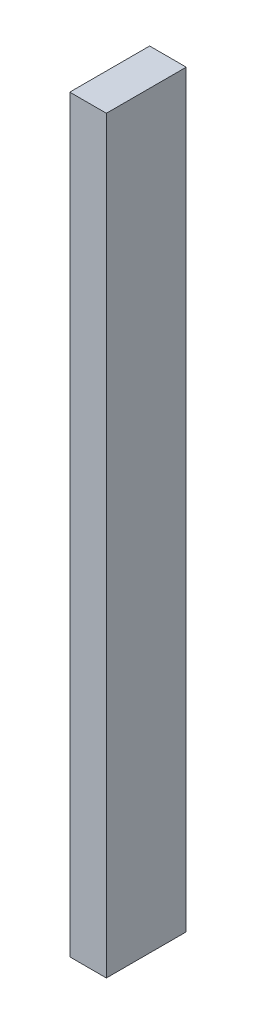
ISO-10303-21;
HEADER;
FILE_DESCRIPTION(('STEP AP214'),'2;1');
FILE_NAME('part.step','',(''),(''),'','','');
FILE_SCHEMA(('AUTOMOTIVE_DESIGN { 1 0 10303 214 1 1 1 1 }'));
ENDSEC;
DATA;
#1=APPLICATION_CONTEXT('core data for automotive mechanical design processes');
#2=APPLICATION_PROTOCOL_DEFINITION('international standard','automotive_design',2000,#1);
#3=PRODUCT_CONTEXT('',#1,'mechanical');
#4=PRODUCT('Part','Part','',(#3));
#5=PRODUCT_RELATED_PRODUCT_CATEGORY('part','',(#4));
#6=PRODUCT_DEFINITION_FORMATION('','',#4);
#7=PRODUCT_DEFINITION_CONTEXT('part definition',#1,'design');
#8=PRODUCT_DEFINITION('design','',#6,#7);
#9=PRODUCT_DEFINITION_SHAPE('','',#8);
#10=(LENGTH_UNIT() NAMED_UNIT(*) SI_UNIT(.MILLI.,.METRE.));
#11=(NAMED_UNIT(*) PLANE_ANGLE_UNIT() SI_UNIT($,.RADIAN.));
#12=(NAMED_UNIT(*) SI_UNIT($,.STERADIAN.) SOLID_ANGLE_UNIT());
#13=UNCERTAINTY_MEASURE_WITH_UNIT(LENGTH_MEASURE(1.E-05),#10,'distance_accuracy_value','');
#14=(GEOMETRIC_REPRESENTATION_CONTEXT(3) GLOBAL_UNCERTAINTY_ASSIGNED_CONTEXT((#13)) GLOBAL_UNIT_ASSIGNED_CONTEXT((#10,
#11,#12)) REPRESENTATION_CONTEXT('',''));
#15=CARTESIAN_POINT('',(0.,0.,0.));
#16=DIRECTION('',(0.,0.,1.));
#17=DIRECTION('',(1.,0.,0.));
#18=AXIS2_PLACEMENT_3D('',#15,#16,#17);
#19=CARTESIAN_POINT('',(22.,-0.01,48.01));
#20=DIRECTION('',(1.,0.,0.));
#21=DIRECTION('',(0.,0.,-1.));
#22=AXIS2_PLACEMENT_3D('',#19,#20,#21);
#23=PLANE('',#22);
#24=DIRECTION('',(0.,0.,-1.));
#25=VECTOR('',#24,1.);
#26=CARTESIAN_POINT('',(22.,450.,24.));
#27=LINE('',#26,#25);
#28=CARTESIAN_POINT('',(22.,450.,48.));
#29=VERTEX_POINT('',#28);
#30=CARTESIAN_POINT('',(22.,450.,0.));
#31=VERTEX_POINT('',#30);
#32=EDGE_CURVE('E69',#29,#31,#27,.T.);
#33=ORIENTED_EDGE('',*,*,#32,.F.);
#34=DIRECTION('',(0.,1.,0.));
#35=VECTOR('',#34,1.);
#36=CARTESIAN_POINT('',(22.,225.,48.));
#37=LINE('',#36,#35);
#38=CARTESIAN_POINT('',(22.,0.,48.));
#39=VERTEX_POINT('',#38);
#40=EDGE_CURVE('E56',#39,#29,#37,.T.);
#41=ORIENTED_EDGE('',*,*,#40,.F.);
#42=DIRECTION('',(0.,0.,1.));
#43=VECTOR('',#42,1.);
#44=CARTESIAN_POINT('',(22.,0.,24.));
#45=LINE('',#44,#43);
#46=CARTESIAN_POINT('',(22.,0.,0.));
#47=VERTEX_POINT('',#46);
#48=EDGE_CURVE('E21',#47,#39,#45,.T.);
#49=ORIENTED_EDGE('',*,*,#48,.F.);
#50=DIRECTION('',(0.,-1.,0.));
#51=VECTOR('',#50,1.);
#52=CARTESIAN_POINT('',(22.,225.,0.));
#53=LINE('',#52,#51);
#54=EDGE_CURVE('E82',#31,#47,#53,.T.);
#55=ORIENTED_EDGE('',*,*,#54,.F.);
#56=EDGE_LOOP('',(#33,#41,#49,#55));
#57=FACE_BOUND('',#56,.T.);
#58=ADVANCED_FACE('F17',(#57),#23,.T.);
#59=CARTESIAN_POINT('',(22.01,0.,48.01));
#60=DIRECTION('',(0.,-1.,0.));
#61=DIRECTION('',(-1.,0.,0.));
#62=AXIS2_PLACEMENT_3D('',#59,#60,#61);
#63=PLANE('',#62);
#64=DIRECTION('',(-1.,0.,0.));
#65=VECTOR('',#64,1.);
#66=CARTESIAN_POINT('',(11.,0.,0.));
#67=LINE('',#66,#65);
#68=CARTESIAN_POINT('',(0.,0.,0.));
#69=VERTEX_POINT('',#68);
#70=EDGE_CURVE('E65',#47,#69,#67,.T.);
#71=ORIENTED_EDGE('',*,*,#70,.F.);
#72=ORIENTED_EDGE('',*,*,#48,.T.);
#73=DIRECTION('',(1.,0.,0.));
#74=VECTOR('',#73,1.);
#75=CARTESIAN_POINT('',(11.,0.,48.));
#76=LINE('',#75,#74);
#77=CARTESIAN_POINT('',(0.,0.,48.));
#78=VERTEX_POINT('',#77);
#79=EDGE_CURVE('E62',#78,#39,#76,.T.);
#80=ORIENTED_EDGE('',*,*,#79,.F.);
#81=DIRECTION('',(0.,0.,1.));
#82=VECTOR('',#81,1.);
#83=CARTESIAN_POINT('',(0.,0.,24.));
#84=LINE('',#83,#82);
#85=EDGE_CURVE('E84',#69,#78,#84,.T.);
#86=ORIENTED_EDGE('',*,*,#85,.F.);
#87=EDGE_LOOP('',(#71,#72,#80,#86));
#88=FACE_BOUND('',#87,.T.);
#89=ADVANCED_FACE('F61',(#88),#63,.T.);
#90=CARTESIAN_POINT('',(-0.01,-0.01,48.));
#91=DIRECTION('',(0.,0.,1.));
#92=DIRECTION('',(1.,0.,0.));
#93=AXIS2_PLACEMENT_3D('',#90,#91,#92);
#94=PLANE('',#93);
#95=DIRECTION('',(1.,0.,0.));
#96=VECTOR('',#95,1.);
#97=CARTESIAN_POINT('',(11.,450.,48.));
#98=LINE('',#97,#96);
#99=CARTESIAN_POINT('',(0.,450.,48.));
#100=VERTEX_POINT('',#99);
#101=EDGE_CURVE('E71',#100,#29,#98,.T.);
#102=ORIENTED_EDGE('',*,*,#101,.F.);
#103=DIRECTION('',(0.,1.,0.));
#104=VECTOR('',#103,1.);
#105=CARTESIAN_POINT('',(0.,225.,48.));
#106=LINE('',#105,#104);
#107=EDGE_CURVE('E75',#78,#100,#106,.T.);
#108=ORIENTED_EDGE('',*,*,#107,.F.);
#109=ORIENTED_EDGE('',*,*,#79,.T.);
#110=ORIENTED_EDGE('',*,*,#40,.T.);
#111=EDGE_LOOP('',(#102,#108,#109,#110));
#112=FACE_BOUND('',#111,.T.);
#113=ADVANCED_FACE('F73',(#112),#94,.T.);
#114=CARTESIAN_POINT('',(-0.00999999999999891,450.,-0.00999999999999891));
#115=DIRECTION('',(0.,1.,0.));
#116=DIRECTION('',(0.,0.,1.));
#117=AXIS2_PLACEMENT_3D('',#114,#115,#116);
#118=PLANE('',#117);
#119=DIRECTION('',(1.,0.,0.));
#120=VECTOR('',#119,1.);
#121=CARTESIAN_POINT('',(11.,450.,0.));
#122=LINE('',#121,#120);
#123=CARTESIAN_POINT('',(0.,450.,0.));
#124=VERTEX_POINT('',#123);
#125=EDGE_CURVE('E36',#124,#31,#122,.T.);
#126=ORIENTED_EDGE('',*,*,#125,.F.);
#127=DIRECTION('',(0.,0.,-1.));
#128=VECTOR('',#127,1.);
#129=CARTESIAN_POINT('',(0.,450.,24.));
#130=LINE('',#129,#128);
#131=EDGE_CURVE('E27',#100,#124,#130,.T.);
#132=ORIENTED_EDGE('',*,*,#131,.F.);
#133=ORIENTED_EDGE('',*,*,#101,.T.);
#134=ORIENTED_EDGE('',*,*,#32,.T.);
#135=EDGE_LOOP('',(#126,#132,#133,#134));
#136=FACE_BOUND('',#135,.T.);
#137=ADVANCED_FACE('F89',(#136),#118,.T.);
#138=CARTESIAN_POINT('',(22.01,-0.01,0.));
#139=DIRECTION('',(0.,0.,-1.));
#140=DIRECTION('',(-1.,0.,0.));
#141=AXIS2_PLACEMENT_3D('',#138,#139,#140);
#142=PLANE('',#141);
#143=ORIENTED_EDGE('',*,*,#125,.T.);
#144=ORIENTED_EDGE('',*,*,#54,.T.);
#145=ORIENTED_EDGE('',*,*,#70,.T.);
#146=DIRECTION('',(0.,-1.,0.));
#147=VECTOR('',#146,1.);
#148=CARTESIAN_POINT('',(0.,225.,0.));
#149=LINE('',#148,#147);
#150=EDGE_CURVE('E11',#124,#69,#149,.T.);
#151=ORIENTED_EDGE('',*,*,#150,.F.);
#152=EDGE_LOOP('',(#143,#144,#145,#151));
#153=FACE_BOUND('',#152,.T.);
#154=ADVANCED_FACE('F91',(#153),#142,.T.);
#155=CARTESIAN_POINT('',(0.,-0.01,-0.01));
#156=DIRECTION('',(-1.,0.,0.));
#157=DIRECTION('',(0.,0.,1.));
#158=AXIS2_PLACEMENT_3D('',#155,#156,#157);
#159=PLANE('',#158);
#160=ORIENTED_EDGE('',*,*,#131,.T.);
#161=ORIENTED_EDGE('',*,*,#150,.T.);
#162=ORIENTED_EDGE('',*,*,#85,.T.);
#163=ORIENTED_EDGE('',*,*,#107,.T.);
#164=EDGE_LOOP('',(#160,#161,#162,#163));
#165=FACE_BOUND('',#164,.T.);
#166=ADVANCED_FACE('F19',(#165),#159,.T.);
#167=CLOSED_SHELL('',(#58,#89,#113,#137,#154,#166));
#168=MANIFOLD_SOLID_BREP('B1',#167);
#169=ADVANCED_BREP_SHAPE_REPRESENTATION('',(#18,#168),#14);
#170=SHAPE_DEFINITION_REPRESENTATION(#9,#169);
ENDSEC;
END-ISO-10303-21;
